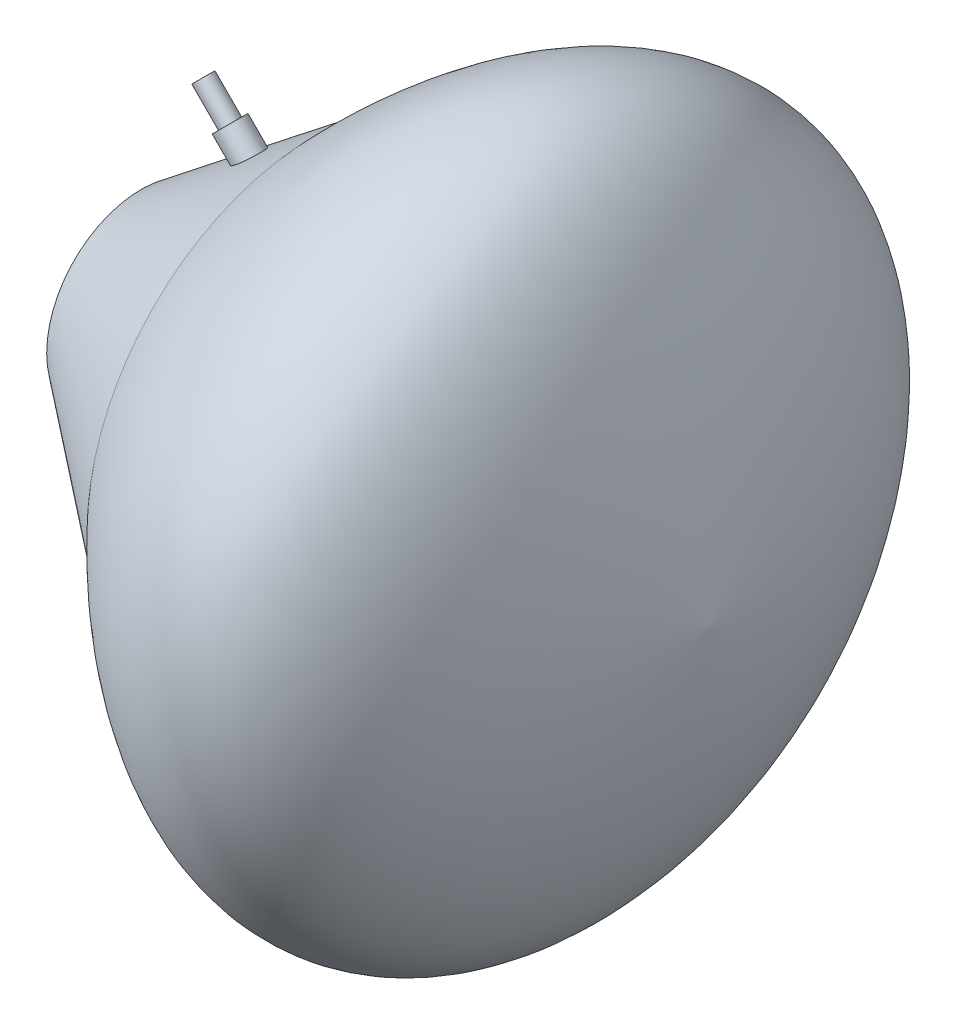
ISO-10303-21;
HEADER;
FILE_DESCRIPTION(('STEP AP214'),'2;1');
FILE_NAME('part.step','',(''),(''),'','','');
FILE_SCHEMA(('AUTOMOTIVE_DESIGN { 1 0 10303 214 1 1 1 1 }'));
ENDSEC;
DATA;
#1=APPLICATION_CONTEXT('core data for automotive mechanical design processes');
#2=APPLICATION_PROTOCOL_DEFINITION('international standard','automotive_design',2000,#1);
#3=PRODUCT_CONTEXT('',#1,'mechanical');
#4=PRODUCT('Part','Part','',(#3));
#5=PRODUCT_RELATED_PRODUCT_CATEGORY('part','',(#4));
#6=PRODUCT_DEFINITION_FORMATION('','',#4);
#7=PRODUCT_DEFINITION_CONTEXT('part definition',#1,'design');
#8=PRODUCT_DEFINITION('design','',#6,#7);
#9=PRODUCT_DEFINITION_SHAPE('','',#8);
#10=(LENGTH_UNIT() NAMED_UNIT(*) SI_UNIT(.MILLI.,.METRE.));
#11=(NAMED_UNIT(*) PLANE_ANGLE_UNIT() SI_UNIT($,.RADIAN.));
#12=(NAMED_UNIT(*) SI_UNIT($,.STERADIAN.) SOLID_ANGLE_UNIT());
#13=UNCERTAINTY_MEASURE_WITH_UNIT(LENGTH_MEASURE(1.E-05),#10,'distance_accuracy_value','');
#14=(GEOMETRIC_REPRESENTATION_CONTEXT(3) GLOBAL_UNCERTAINTY_ASSIGNED_CONTEXT((#13)) GLOBAL_UNIT_ASSIGNED_CONTEXT((#10,
#11,#12)) REPRESENTATION_CONTEXT('',''));
#15=CARTESIAN_POINT('',(0.,0.,0.));
#16=DIRECTION('',(0.,0.,1.));
#17=DIRECTION('',(1.,0.,0.));
#18=AXIS2_PLACEMENT_3D('',#15,#16,#17);
#19=CARTESIAN_POINT('',(46.059604384412,0.,0.));
#20=DIRECTION('',(1.,0.,0.));
#21=DIRECTION('',(0.,0.,-1.));
#22=AXIS2_PLACEMENT_3D('',#19,#20,#21);
#23=CONICAL_SURFACE('',#22,60.3593578430898,0.654725002311477);
#24=CARTESIAN_POINT('',(46.059604384412,0.,0.));
#25=DIRECTION('',(-1.,0.,0.));
#26=DIRECTION('',(0.,0.,1.));
#27=AXIS2_PLACEMENT_3D('',#24,#25,#26);
#28=CIRCLE('',#27,60.3593578430898);
#29=CARTESIAN_POINT('',(46.059604384412,0.,60.3593578430899));
#30=VERTEX_POINT('',#29);
#31=EDGE_CURVE('E57',#30,#30,#28,.T.);
#32=ORIENTED_EDGE('',*,*,#31,.T.);
#33=EDGE_LOOP('',(#32));
#34=FACE_BOUND('',#33,.T.);
#35=CARTESIAN_POINT('',(0.,0.,0.));
#36=DIRECTION('',(-1.,0.,0.));
#37=DIRECTION('',(0.,0.,1.));
#38=AXIS2_PLACEMENT_3D('',#35,#36,#37);
#39=CIRCLE('',#38,25.);
#40=CARTESIAN_POINT('',(0.,0.,25.0000000000001));
#41=VERTEX_POINT('',#40);
#42=EDGE_CURVE('E73',#41,#41,#39,.T.);
#43=ORIENTED_EDGE('',*,*,#42,.F.);
#44=EDGE_LOOP('',(#43));
#45=FACE_BOUND('',#44,.T.);
#46=CARTESIAN_POINT('',(25.5496015434709,44.5938330665931,-1.34443770316739));
#47=CARTESIAN_POINT('',(25.486968879316,44.5517378251865,-1.14505475540968));
#48=CARTESIAN_POINT('',(25.4380903283021,44.5190734997125,-0.939213205199757));
#49=CARTESIAN_POINT('',(25.369696285818,44.4734322394264,-0.520434436811357));
#50=CARTESIAN_POINT('',(25.3502094793954,44.460474537308,-0.307490493853322));
#51=CARTESIAN_POINT('',(25.3413801631892,44.4545987645062,0.119259213378273));
#52=CARTESIAN_POINT('',(25.3520297520059,44.4616754410504,0.333064737078013));
#53=CARTESIAN_POINT('',(25.4030639874371,44.4956891282372,0.755430215637354));
#54=CARTESIAN_POINT('',(25.4434429784647,44.5226223614595,0.963991160398971));
#55=CARTESIAN_POINT('',(25.552417777191,44.5956792470439,1.36991405888987));
#56=CARTESIAN_POINT('',(25.6209939983603,44.6417895787491,1.5672836783302));
#57=CARTESIAN_POINT('',(25.7839681763073,44.7521335961352,1.9456119157839));
#58=CARTESIAN_POINT('',(25.8783685047416,44.8163689464141,2.12656902445748));
#59=CARTESIAN_POINT('',(26.0912538056845,44.9624642646045,2.46953009273971));
#60=CARTESIAN_POINT('',(26.2100392993076,45.0445449858634,2.63125338199193));
#61=CARTESIAN_POINT('',(26.4670846041229,45.2239306440057,2.92868725953538));
#62=CARTESIAN_POINT('',(26.6053462077954,45.3212369822674,3.06439545081467));
#63=CARTESIAN_POINT('',(26.8995824671926,45.5305709194662,3.30829886258755));
#64=CARTESIAN_POINT('',(27.0558153828656,45.642818112127,3.4159942900606));
#65=CARTESIAN_POINT('',(27.3793503651163,45.8779781806003,3.59792372323017));
#66=CARTESIAN_POINT('',(27.5466529957244,46.000891599984,3.67215602238602));
#67=CARTESIAN_POINT('',(27.8888267208305,46.2552666691299,3.78553243166332));
#68=CARTESIAN_POINT('',(28.0637479140238,46.3867891861721,3.82438916580193));
#69=CARTESIAN_POINT('',(28.4148130431035,46.6538788696328,3.86477036616158));
#70=CARTESIAN_POINT('',(28.5909569662056,46.7894459938108,3.86629522212692));
#71=CARTESIAN_POINT('',(28.9388975251142,47.0602763267591,3.83186373432727));
#72=CARTESIAN_POINT('',(29.1107060658095,47.1955391546855,3.79602496379088));
#73=CARTESIAN_POINT('',(29.4457308240466,47.4620837534697,3.68790114371862));
#74=CARTESIAN_POINT('',(29.6089474068299,47.5933656934531,3.61561764482143));
#75=CARTESIAN_POINT('',(29.9210081781107,47.8467606967134,3.43727242293638));
#76=CARTESIAN_POINT('',(30.0699577590374,47.9689392251267,3.33148810684993));
#77=CARTESIAN_POINT('',(30.350965221095,48.2013395740165,3.08889720255959));
#78=CARTESIAN_POINT('',(30.4830237069638,48.3115618225323,2.95209172546733));
#79=CARTESIAN_POINT('',(30.7259632520799,48.5157218211179,2.65232442709919));
#80=CARTESIAN_POINT('',(30.836977554787,48.6097616561399,2.48954008225743));
#81=CARTESIAN_POINT('',(31.0360550577593,48.7792996631207,2.14179263549267));
#82=CARTESIAN_POINT('',(31.1241186812111,48.8547981769606,1.95682994260697));
#83=CARTESIAN_POINT('',(31.2748352732231,48.9844974938841,1.57062036665419));
#84=CARTESIAN_POINT('',(31.3375685268896,49.0387655699662,1.36942739758349));
#85=CARTESIAN_POINT('',(31.4364787561508,49.1245129769819,0.955962451688294));
#86=CARTESIAN_POINT('',(31.4726559019142,49.1559924539425,0.743690545865778));
#87=CARTESIAN_POINT('',(31.5175464174831,49.1950740506145,0.314325462183308));
#88=CARTESIAN_POINT('',(31.5262876552104,49.2027003990251,0.097237402251544));
#89=CARTESIAN_POINT('',(31.5161729310177,49.1938855512159,-0.33580398991522));
#90=CARTESIAN_POINT('',(31.4973170341311,49.1774444117115,-0.551757324823021));
#91=CARTESIAN_POINT('',(31.4324725491026,49.1210576067079,-0.976358870051562));
#92=CARTESIAN_POINT('',(31.3864888310209,49.081116160051,-1.18500838445361));
#93=CARTESIAN_POINT('',(31.2685181134758,48.9790835294276,-1.58912298644677));
#94=CARTESIAN_POINT('',(31.1965311618871,48.916992386241,-1.78458809831092));
#95=CARTESIAN_POINT('',(31.0283160630431,48.7727327791425,-2.15683999267909));
#96=CARTESIAN_POINT('',(30.9320823907772,48.6905597393716,-2.33362250499841));
#97=CARTESIAN_POINT('',(30.7178008401966,48.5088847782002,-2.66346775094696));
#98=CARTESIAN_POINT('',(30.5997530021868,48.4093828888173,-2.81653052840102));
#99=CARTESIAN_POINT('',(30.3447105653328,48.1961970781674,-3.09481600175266));
#100=CARTESIAN_POINT('',(30.2076941027531,48.0824968065066,-3.220006130244));
#101=CARTESIAN_POINT('',(29.9183884915085,47.8446748947671,-3.43886588041398));
#102=CARTESIAN_POINT('',(29.7660991479058,47.7205531216754,-3.53253509970437));
#103=CARTESIAN_POINT('',(29.4497245634354,47.465333714525,-3.6861109186785));
#104=CARTESIAN_POINT('',(29.2856000189106,47.3342132517214,-3.74589857517952));
#105=CARTESIAN_POINT('',(28.9504573851744,47.0693785355435,-3.82968508029821));
#106=CARTESIAN_POINT('',(28.7794390435736,46.9356641872973,-3.8536826173766));
#107=CARTESIAN_POINT('',(28.4340012492793,46.6686080038108,-3.86542458147609));
#108=CARTESIAN_POINT('',(28.2595665297493,46.5352749816664,-3.85291976164896));
#109=CARTESIAN_POINT('',(27.9133382155576,46.2736295334923,-3.79161208818515));
#110=CARTESIAN_POINT('',(27.7415446693021,46.1453171994126,-3.74280857009181));
#111=CARTESIAN_POINT('',(27.4041709119314,45.8961189675504,-3.60981392410979));
#112=CARTESIAN_POINT('',(27.23865015816,45.7752993762618,-3.52534763673455));
#113=CARTESIAN_POINT('',(26.9201390603335,45.5452459398223,-3.32332255015381));
#114=CARTESIAN_POINT('',(26.7671521283612,45.436015247146,-3.20575477812048));
#115=CARTESIAN_POINT('',(26.4780583479907,45.2315626519366,-2.94036609049268));
#116=CARTESIAN_POINT('',(26.3420025271763,45.1363829434864,-2.79245711754856));
#117=CARTESIAN_POINT('',(26.0918452462415,44.9628026297986,-2.47074622833521));
#118=CARTESIAN_POINT('',(25.9777176050216,44.8843820023709,-2.29697563516485));
#119=CARTESIAN_POINT('',(25.8104761766671,44.7701994815263,-1.99263269277999));
#120=CARTESIAN_POINT('',(25.7499441493006,44.7290850429739,-1.86804320795452));
#121=CARTESIAN_POINT('',(25.6407074805677,44.6551507343154,-1.61143500457203));
#122=CARTESIAN_POINT('',(25.5920027257529,44.6223307846476,-1.47941635729125));
#123=CARTESIAN_POINT('',(25.5496015434709,44.5938330665931,-1.34443770316739));
#124=B_SPLINE_CURVE_WITH_KNOTS('',3,(#46,#47,#48,#49,#50,#51,#52,#53,#54,#55,#56,#57,#58,#59,
#60,#61,#62,#63,#64,#65,#66,#67,#68,#69,#70,#71,#72,#73,#74,#75,#76,#77,#78,#79,#80,#81,#82,#83,
#84,#85,#86,#87,#88,#89,#90,#91,#92,#93,#94,#95,#96,#97,#98,#99,#100,#101,#102,#103,#104,#105,
#106,#107,#108,#109,#110,#111,#112,#113,#114,#115,#116,#117,#118,#119,#120,#121,#122,#123),
.UNSPECIFIED.,.T.,.F.,(4,2,2,2,2,2,2,2,2,2,2,2,2,2,2,2,2,2,2,2,2,2,2,2,2,2,2,2,2,2,2,2,2,2,2,2,
2,2,4),(0.,0.639038758312045,1.27870078765441,1.91819512085977,2.55756783097802,
3.19649716445536,3.83548519618668,4.48287982479402,5.13033407522447,5.7886508762721,
6.44700124612797,7.11065325293983,7.7742983312307,8.4358613829268,9.09739628902397,
9.75359054162637,10.409761294466,11.0616274830284,11.7134816510113,12.3632532231172,
13.0130206315203,13.6621278271445,14.311233493136,14.9602226653604,15.6092106427367,
16.2583466365591,16.9074814310166,17.5573707632067,18.2072683914111,18.8594336098068,
19.5116227263984,20.1682755413717,20.8249403768334,21.4867671277688,22.1487734532579,
22.8127289732983,23.4758867708725,23.9085086170362,24.3411263132835),.UNSPECIFIED.);
#125=CARTESIAN_POINT('',(25.5496015434709,44.5938330665931,-1.34443770316739));
#126=VERTEX_POINT('',#125);
#127=EDGE_CURVE('E13',#126,#126,#124,.T.);
#128=ORIENTED_EDGE('',*,*,#127,.F.);
#129=EDGE_LOOP('',(#128));
#130=FACE_BOUND('',#129,.T.);
#131=ADVANCED_FACE('F46',(#34,#45,#130),#23,.T.);
#132=CARTESIAN_POINT('',(150.170471105108,0.,0.));
#133=CARTESIAN_POINT('',(127.957826231343,146.665270251617,-2.77555756156289E-13));
#134=CARTESIAN_POINT('',(46.059604384412,60.35935784309,0.));
#135=B_SPLINE_CURVE_WITH_KNOTS('',2,(#132,#133,#134),.UNSPECIFIED.,.F.,.F.,(3,3),(0.,1.),.UNSPECIFIED.);
#136=CARTESIAN_POINT('',(0.,0.,0.));
#137=DIRECTION('',(-1.,0.,0.));
#138=AXIS1_PLACEMENT('',#136,#137);
#139=SURFACE_OF_REVOLUTION('',#135,#138);
#140=ORIENTED_EDGE('',*,*,#31,.F.);
#141=EDGE_LOOP('',(#140));
#142=FACE_BOUND('',#141,.T.);
#143=CARTESIAN_POINT('',(150.170471105108,0.,0.));
#144=VERTEX_POINT('',#143);
#145=VERTEX_LOOP('',#144);
#146=FACE_BOUND('',#145,.T.);
#147=ADVANCED_FACE('F48',(#142,#146),#139,.T.);
#148=CARTESIAN_POINT('',(0.,0.,0.));
#149=DIRECTION('',(1.,0.,0.));
#150=DIRECTION('',(0.,0.,-1.));
#151=AXIS2_PLACEMENT_3D('',#148,#149,#150);
#152=PLANE('',#151);
#153=ORIENTED_EDGE('',*,*,#42,.T.);
#154=EDGE_LOOP('',(#153));
#155=FACE_BOUND('',#154,.T.);
#156=ADVANCED_FACE('F61',(#155),#152,.F.);
#157=CARTESIAN_POINT('',(23.4888240607887,51.7730953082508,0.));
#158=DIRECTION('',(0.707106781186547,-0.707106781186549,0.));
#159=DIRECTION('',(0.707106781186548,0.707106781186549,0.));
#160=AXIS2_PLACEMENT_3D('',#157,#158,#159);
#161=CYLINDRICAL_SURFACE('',#160,3.86095178219591);
#162=CARTESIAN_POINT('',(23.4888240607887,51.7730953082508,0.));
#163=DIRECTION('',(-0.707106781186547,0.707106781186549,0.));
#164=DIRECTION('',(-0.707106781186548,-0.707106781186549,0.));
#165=AXIS2_PLACEMENT_3D('',#162,#163,#164);
#166=CIRCLE('',#165,3.86095178219591);
#167=CARTESIAN_POINT('',(20.7587188737637,49.0429901212257,0.));
#168=VERTEX_POINT('',#167);
#169=EDGE_CURVE('E80',#168,#168,#166,.T.);
#170=ORIENTED_EDGE('',*,*,#169,.F.);
#171=EDGE_LOOP('',(#170));
#172=FACE_BOUND('',#171,.T.);
#173=ORIENTED_EDGE('',*,*,#127,.T.);
#174=EDGE_LOOP('',(#173));
#175=FACE_BOUND('',#174,.T.);
#176=ADVANCED_FACE('F67',(#172,#175),#161,.T.);
#177=CARTESIAN_POINT('',(23.4888240607887,51.7730953082508,0.));
#178=DIRECTION('',(-0.707106781186547,0.707106781186549,0.));
#179=DIRECTION('',(-0.707106781186548,-0.707106781186549,0.));
#180=AXIS2_PLACEMENT_3D('',#177,#178,#179);
#181=PLANE('',#180);
#182=CARTESIAN_POINT('',(23.4888240607888,51.7730953082508,0.));
#183=DIRECTION('',(-0.707106781186547,0.707106781186549,0.));
#184=DIRECTION('',(-0.707106781186548,-0.707106781186549,0.));
#185=AXIS2_PLACEMENT_3D('',#182,#183,#184);
#186=CIRCLE('',#185,2.5);
#187=CARTESIAN_POINT('',(21.7210571078224,50.0053283552844,0.));
#188=VERTEX_POINT('',#187);
#189=EDGE_CURVE('E78',#188,#188,#186,.T.);
#190=ORIENTED_EDGE('',*,*,#189,.F.);
#191=EDGE_LOOP('',(#190));
#192=FACE_BOUND('',#191,.T.);
#193=ORIENTED_EDGE('',*,*,#169,.T.);
#194=EDGE_LOOP('',(#193));
#195=FACE_BOUND('',#194,.T.);
#196=ADVANCED_FACE('F95',(#192,#195),#181,.T.);
#197=CARTESIAN_POINT('',(16.4177562489233,58.8441631201162,0.));
#198=DIRECTION('',(-0.707106781186547,0.707106781186549,0.));
#199=DIRECTION('',(-0.707106781186548,-0.707106781186549,0.));
#200=AXIS2_PLACEMENT_3D('',#197,#198,#199);
#201=PLANE('',#200);
#202=CARTESIAN_POINT('',(16.4177562489233,58.8441631201162,0.));
#203=DIRECTION('',(-0.707106781186547,0.707106781186549,0.));
#204=DIRECTION('',(-0.707106781186548,-0.707106781186549,0.));
#205=AXIS2_PLACEMENT_3D('',#202,#203,#204);
#206=CIRCLE('',#205,2.5);
#207=CARTESIAN_POINT('',(14.6499892959569,57.0763961671499,0.));
#208=VERTEX_POINT('',#207);
#209=EDGE_CURVE('E76',#208,#208,#206,.T.);
#210=ORIENTED_EDGE('',*,*,#209,.T.);
#211=EDGE_LOOP('',(#210));
#212=FACE_BOUND('',#211,.T.);
#213=ADVANCED_FACE('F104',(#212),#201,.T.);
#214=CARTESIAN_POINT('',(16.4177562489233,58.8441631201162,0.));
#215=DIRECTION('',(0.707106781186547,-0.707106781186549,0.));
#216=DIRECTION('',(0.707106781186548,0.707106781186549,0.));
#217=AXIS2_PLACEMENT_3D('',#214,#215,#216);
#218=CYLINDRICAL_SURFACE('',#217,2.5);
#219=ORIENTED_EDGE('',*,*,#189,.T.);
#220=EDGE_LOOP('',(#219));
#221=FACE_BOUND('',#220,.T.);
#222=ORIENTED_EDGE('',*,*,#209,.F.);
#223=EDGE_LOOP('',(#222));
#224=FACE_BOUND('',#223,.T.);
#225=ADVANCED_FACE('F111',(#221,#224),#218,.T.);
#226=CLOSED_SHELL('',(#131,#147,#156,#176,#196,#213,#225));
#227=MANIFOLD_SOLID_BREP('B2',#226);
#228=ADVANCED_BREP_SHAPE_REPRESENTATION('',(#18,#227),#14);
#229=SHAPE_DEFINITION_REPRESENTATION(#9,#228);
ENDSEC;
END-ISO-10303-21;
